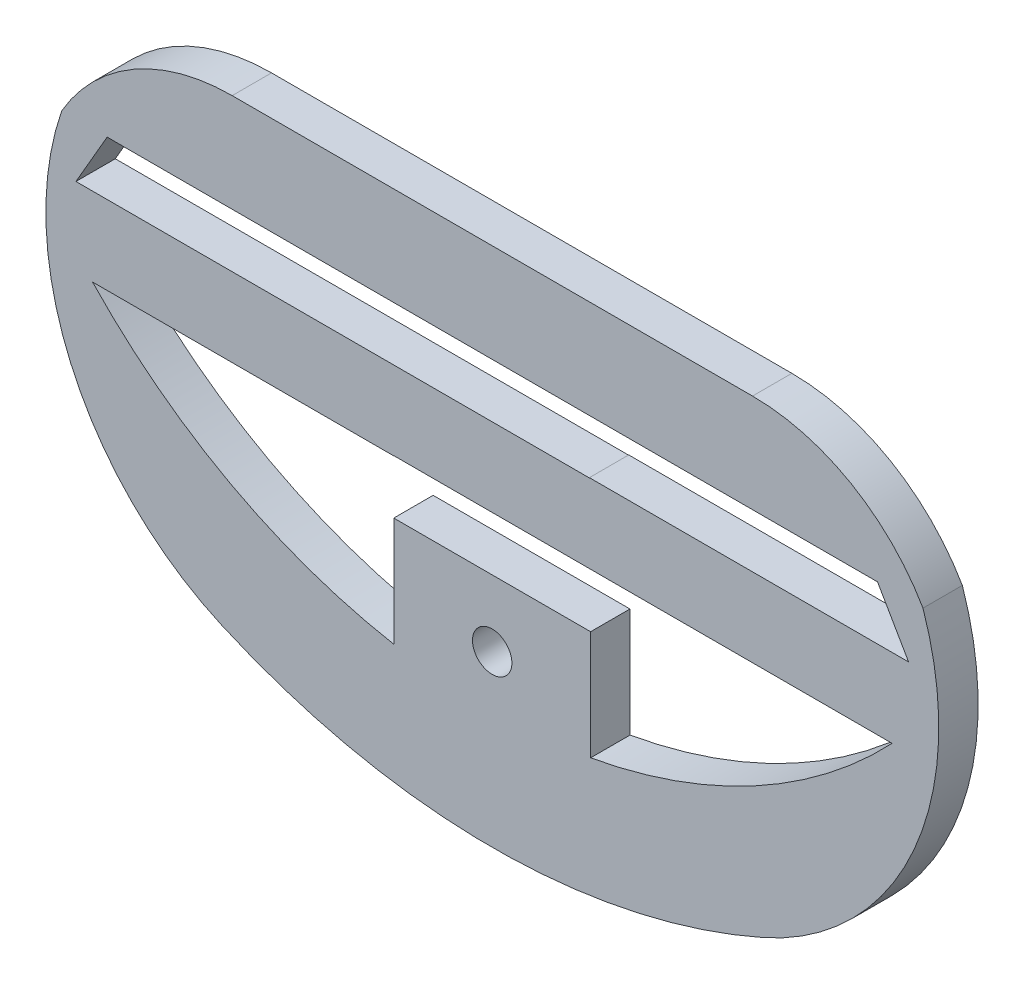
ISO-10303-21;
HEADER;
FILE_DESCRIPTION(('STEP AP214'),'2;1');
FILE_NAME('part.step','',(''),(''),'','','');
FILE_SCHEMA(('AUTOMOTIVE_DESIGN { 1 0 10303 214 1 1 1 1 }'));
ENDSEC;
DATA;
#1=APPLICATION_CONTEXT('core data for automotive mechanical design processes');
#2=APPLICATION_PROTOCOL_DEFINITION('international standard','automotive_design',2000,#1);
#3=PRODUCT_CONTEXT('',#1,'mechanical');
#4=PRODUCT('Part','Part','',(#3));
#5=PRODUCT_RELATED_PRODUCT_CATEGORY('part','',(#4));
#6=PRODUCT_DEFINITION_FORMATION('','',#4);
#7=PRODUCT_DEFINITION_CONTEXT('part definition',#1,'design');
#8=PRODUCT_DEFINITION('design','',#6,#7);
#9=PRODUCT_DEFINITION_SHAPE('','',#8);
#10=(LENGTH_UNIT() NAMED_UNIT(*) SI_UNIT(.MILLI.,.METRE.));
#11=(NAMED_UNIT(*) PLANE_ANGLE_UNIT() SI_UNIT($,.RADIAN.));
#12=(NAMED_UNIT(*) SI_UNIT($,.STERADIAN.) SOLID_ANGLE_UNIT());
#13=UNCERTAINTY_MEASURE_WITH_UNIT(LENGTH_MEASURE(1.E-05),#10,'distance_accuracy_value','');
#14=(GEOMETRIC_REPRESENTATION_CONTEXT(3) GLOBAL_UNCERTAINTY_ASSIGNED_CONTEXT((#13)) GLOBAL_UNIT_ASSIGNED_CONTEXT((#10,
#11,#12)) REPRESENTATION_CONTEXT('',''));
#15=CARTESIAN_POINT('',(0.,0.,0.));
#16=DIRECTION('',(0.,0.,1.));
#17=DIRECTION('',(1.,0.,0.));
#18=AXIS2_PLACEMENT_3D('',#15,#16,#17);
#19=CARTESIAN_POINT('',(0.,0.,2.));
#20=DIRECTION('',(0.,0.,-1.));
#21=DIRECTION('',(-1.,0.,0.));
#22=AXIS2_PLACEMENT_3D('',#19,#20,#21);
#23=CYLINDRICAL_SURFACE('',#22,33.96);
#24=CARTESIAN_POINT('',(0.,0.,0.));
#25=DIRECTION('',(0.,0.,1.));
#26=DIRECTION('',(1.,0.,0.));
#27=AXIS2_PLACEMENT_3D('',#24,#25,#26);
#28=CIRCLE('',#27,33.96);
#29=CARTESIAN_POINT('',(-13.7477446250861,-31.0528761586333,0.));
#30=VERTEX_POINT('',#29);
#31=CARTESIAN_POINT('',(13.7709780833439,-31.0425798320317,0.));
#32=VERTEX_POINT('',#31);
#33=EDGE_CURVE('E233',#30,#32,#28,.T.);
#34=ORIENTED_EDGE('',*,*,#33,.T.);
#35=DIRECTION('',(0.,0.,-1.));
#36=VECTOR('',#35,1.);
#37=CARTESIAN_POINT('',(13.7709780833439,-31.0425798320317,2.));
#38=LINE('',#37,#36);
#39=CARTESIAN_POINT('',(13.7709780833439,-31.0425798320317,2.));
#40=VERTEX_POINT('',#39);
#41=EDGE_CURVE('E50',#32,#40,#38,.F.);
#42=ORIENTED_EDGE('',*,*,#41,.T.);
#43=CARTESIAN_POINT('',(0.,0.,2.));
#44=DIRECTION('',(0.,0.,1.));
#45=DIRECTION('',(1.,0.,0.));
#46=AXIS2_PLACEMENT_3D('',#43,#44,#45);
#47=CIRCLE('',#46,33.96);
#48=CARTESIAN_POINT('',(-13.7477446250861,-31.0528761586333,2.));
#49=VERTEX_POINT('',#48);
#50=EDGE_CURVE('E214',#49,#40,#47,.T.);
#51=ORIENTED_EDGE('',*,*,#50,.F.);
#52=DIRECTION('',(0.,0.,-1.));
#53=VECTOR('',#52,1.);
#54=CARTESIAN_POINT('',(-13.7477446250861,-31.0528761586333,2.));
#55=LINE('',#54,#53);
#56=EDGE_CURVE('E283',#49,#30,#55,.T.);
#57=ORIENTED_EDGE('',*,*,#56,.T.);
#58=EDGE_LOOP('',(#34,#42,#51,#57));
#59=FACE_BOUND('',#58,.T.);
#60=ADVANCED_FACE('F35',(#59),#23,.T.);
#61=CARTESIAN_POINT('',(0.,0.,2.));
#62=DIRECTION('',(0.,0.,1.));
#63=DIRECTION('',(1.,0.,0.));
#64=AXIS2_PLACEMENT_3D('',#61,#62,#63);
#65=PLANE('',#64);
#66=DIRECTION('',(0.499999999999998,-0.86602540378444,0.));
#67=VECTOR('',#66,1.);
#68=CARTESIAN_POINT('',(9.27398162348433,5.3543357867783,2.));
#69=LINE('',#68,#67);
#70=CARTESIAN_POINT('',(19.5760693092514,-12.489403509,2.));
#71=VERTEX_POINT('',#70);
#72=CARTESIAN_POINT('',(21.1546665809614,-15.2236141882913,2.));
#73=VERTEX_POINT('',#72);
#74=EDGE_CURVE('E191',#71,#73,#69,.T.);
#75=ORIENTED_EDGE('',*,*,#74,.T.);
#76=DIRECTION('',(1.,0.,0.));
#77=VECTOR('',#76,1.);
#78=CARTESIAN_POINT('',(0.,-15.2236141882913,2.));
#79=LINE('',#78,#77);
#80=CARTESIAN_POINT('',(4.93751626275969,-15.2236141882913,2.));
#81=VERTEX_POINT('',#80);
#82=EDGE_CURVE('E570',#81,#73,#79,.T.);
#83=ORIENTED_EDGE('',*,*,#82,.F.);
#84=DIRECTION('',(0.,1.,0.));
#85=VECTOR('',#84,1.);
#86=CARTESIAN_POINT('',(4.93751626275969,0.,2.));
#87=LINE('',#86,#85);
#88=CARTESIAN_POINT('',(4.93751626275969,-15.2357893207087,2.));
#89=VERTEX_POINT('',#88);
#90=EDGE_CURVE('E573',#89,#81,#87,.T.);
#91=ORIENTED_EDGE('',*,*,#90,.F.);
#92=DIRECTION('',(-1.,0.,0.));
#93=VECTOR('',#92,1.);
#94=CARTESIAN_POINT('',(0.,-15.2357893207087,2.));
#95=LINE('',#94,#93);
#96=CARTESIAN_POINT('',(-21.1467627991821,-15.2357893207087,2.));
#97=VERTEX_POINT('',#96);
#98=EDGE_CURVE('E580',#89,#97,#95,.T.);
#99=ORIENTED_EDGE('',*,*,#98,.T.);
#100=DIRECTION('',(-0.499999999999998,-0.86602540378444,0.));
#101=VECTOR('',#100,1.);
#102=CARTESIAN_POINT('',(-9.26278180016591,5.34786956577053,2.));
#103=LINE('',#102,#101);
#104=CARTESIAN_POINT('',(-19.5611362114935,-12.489403509,2.));
#105=VERTEX_POINT('',#104);
#106=EDGE_CURVE('E182',#105,#97,#103,.T.);
#107=ORIENTED_EDGE('',*,*,#106,.F.);
#108=DIRECTION('',(-1.,0.,0.));
#109=VECTOR('',#108,1.);
#110=CARTESIAN_POINT('',(0.,-12.489403509,2.));
#111=LINE('',#110,#109);
#112=EDGE_CURVE('E190',#71,#105,#111,.T.);
#113=ORIENTED_EDGE('',*,*,#112,.F.);
#114=EDGE_LOOP('',(#75,#83,#91,#99,#107,#113));
#115=FACE_BOUND('',#114,.T.);
#116=CARTESIAN_POINT('',(0.,0.,2.));
#117=DIRECTION('',(0.,0.,1.));
#118=DIRECTION('',(1.,0.,0.));
#119=AXIS2_PLACEMENT_3D('',#116,#117,#118);
#120=CIRCLE('',#119,27.97);
#121=CARTESIAN_POINT('',(-20.3053024899731,-19.2357893207087,2.));
#122=VERTEX_POINT('',#121);
#123=CARTESIAN_POINT('',(-5.,-27.5194640209434,2.));
#124=VERTEX_POINT('',#123);
#125=EDGE_CURVE('E212',#122,#124,#120,.T.);
#126=ORIENTED_EDGE('',*,*,#125,.F.);
#127=DIRECTION('',(-1.,0.,0.));
#128=VECTOR('',#127,1.);
#129=CARTESIAN_POINT('',(0.,-19.2357893207087,2.));
#130=LINE('',#129,#128);
#131=CARTESIAN_POINT('',(-5.,-19.2357893207087,2.));
#132=VERTEX_POINT('',#131);
#133=EDGE_CURVE('E583',#132,#122,#130,.T.);
#134=ORIENTED_EDGE('',*,*,#133,.F.);
#135=DIRECTION('',(0.,1.,0.));
#136=VECTOR('',#135,1.);
#137=CARTESIAN_POINT('',(-5.,0.,2.));
#138=LINE('',#137,#136);
#139=CARTESIAN_POINT('',(-5.,-19.2236141882913,2.));
#140=VERTEX_POINT('',#139);
#141=EDGE_CURVE('E569',#132,#140,#138,.T.);
#142=ORIENTED_EDGE('',*,*,#141,.T.);
#143=DIRECTION('',(1.,0.,0.));
#144=VECTOR('',#143,1.);
#145=CARTESIAN_POINT('',(0.,-19.2236141882913,2.));
#146=LINE('',#145,#144);
#147=CARTESIAN_POINT('',(20.3168294165139,-19.2236141882913,2.));
#148=VERTEX_POINT('',#147);
#149=EDGE_CURVE('E566',#140,#148,#146,.T.);
#150=ORIENTED_EDGE('',*,*,#149,.T.);
#151=CARTESIAN_POINT('',(0.,0.,2.));
#152=DIRECTION('',(0.,0.,1.));
#153=DIRECTION('',(1.,0.,0.));
#154=AXIS2_PLACEMENT_3D('',#151,#152,#153);
#155=CIRCLE('',#154,27.97);
#156=CARTESIAN_POINT('',(5.,-27.5194640209434,2.));
#157=VERTEX_POINT('',#156);
#158=EDGE_CURVE('E217',#157,#148,#155,.T.);
#159=ORIENTED_EDGE('',*,*,#158,.F.);
#160=DIRECTION('',(0.,-1.,0.));
#161=VECTOR('',#160,1.);
#162=CARTESIAN_POINT('',(5.,0.,2.));
#163=LINE('',#162,#161);
#164=CARTESIAN_POINT('',(5.,-21.97,2.));
#165=VERTEX_POINT('',#164);
#166=EDGE_CURVE('E220',#165,#157,#163,.T.);
#167=ORIENTED_EDGE('',*,*,#166,.F.);
#168=DIRECTION('',(-1.,0.,0.));
#169=VECTOR('',#168,1.);
#170=CARTESIAN_POINT('',(0.,-21.97,2.));
#171=LINE('',#170,#169);
#172=CARTESIAN_POINT('',(-5.,-21.97,2.));
#173=VERTEX_POINT('',#172);
#174=EDGE_CURVE('E223',#165,#173,#171,.T.);
#175=ORIENTED_EDGE('',*,*,#174,.T.);
#176=DIRECTION('',(0.,-1.,0.));
#177=VECTOR('',#176,1.);
#178=CARTESIAN_POINT('',(-5.,0.,2.));
#179=LINE('',#178,#177);
#180=EDGE_CURVE('E225',#173,#124,#179,.T.);
#181=ORIENTED_EDGE('',*,*,#180,.T.);
#182=EDGE_LOOP('',(#126,#134,#142,#150,#159,#167,#175,#181));
#183=FACE_BOUND('',#182,.T.);
#184=CARTESIAN_POINT('',(0.,-25.35,2.));
#185=DIRECTION('',(0.,0.,1.));
#186=DIRECTION('',(1.,0.,0.));
#187=AXIS2_PLACEMENT_3D('',#184,#185,#186);
#188=CIRCLE('',#187,1.);
#189=CARTESIAN_POINT('',(1.,-25.35,2.));
#190=VERTEX_POINT('',#189);
#191=EDGE_CURVE('E228',#190,#190,#188,.T.);
#192=ORIENTED_EDGE('',*,*,#191,.F.);
#193=EDGE_LOOP('',(#192));
#194=FACE_BOUND('',#193,.T.);
#195=ORIENTED_EDGE('',*,*,#50,.T.);
#196=CARTESIAN_POINT('',(7.68839059070083,-17.3311929804276,2.));
#197=DIRECTION('',(0.,0.,1.));
#198=DIRECTION('',(1.,0.,0.));
#199=AXIS2_PLACEMENT_3D('',#196,#197,#198);
#200=CIRCLE('',#199,15.);
#201=CARTESIAN_POINT('',(21.8854703860099,-12.489403509,2.));
#202=VERTEX_POINT('',#201);
#203=EDGE_CURVE('E11',#40,#202,#200,.T.);
#204=ORIENTED_EDGE('',*,*,#203,.T.);
#205=CARTESIAN_POINT('',(13.2252163481655,-17.489403509,2.));
#206=DIRECTION('',(0.,0.,1.));
#207=DIRECTION('',(1.,0.,0.));
#208=AXIS2_PLACEMENT_3D('',#205,#206,#207);
#209=CIRCLE('',#208,10.);
#210=CARTESIAN_POINT('',(13.2252163481655,-7.489403509,2.));
#211=VERTEX_POINT('',#210);
#212=EDGE_CURVE('E272',#202,#211,#209,.T.);
#213=ORIENTED_EDGE('',*,*,#212,.T.);
#214=DIRECTION('',(1.,0.,0.));
#215=VECTOR('',#214,1.);
#216=CARTESIAN_POINT('',(0.,-7.489403509,2.));
#217=LINE('',#216,#215);
#218=CARTESIAN_POINT('',(-13.2102832504076,-7.489403509,2.));
#219=VERTEX_POINT('',#218);
#220=EDGE_CURVE('E199',#219,#211,#217,.T.);
#221=ORIENTED_EDGE('',*,*,#220,.F.);
#222=CARTESIAN_POINT('',(-13.2102832504076,-17.489403509,2.));
#223=DIRECTION('',(0.,0.,1.));
#224=DIRECTION('',(1.,0.,0.));
#225=AXIS2_PLACEMENT_3D('',#222,#223,#224);
#226=CIRCLE('',#225,10.);
#227=CARTESIAN_POINT('',(-21.870537288252,-12.489403509,2.));
#228=VERTEX_POINT('',#227);
#229=EDGE_CURVE('E274',#219,#228,#226,.T.);
#230=ORIENTED_EDGE('',*,*,#229,.T.);
#231=CARTESIAN_POINT('',(-7.67541926064876,-17.3369414595903,2.));
#232=DIRECTION('',(0.,0.,1.));
#233=DIRECTION('',(1.,0.,0.));
#234=AXIS2_PLACEMENT_3D('',#231,#232,#233);
#235=CIRCLE('',#234,15.);
#236=EDGE_CURVE('E43',#228,#49,#235,.T.);
#237=ORIENTED_EDGE('',*,*,#236,.T.);
#238=EDGE_LOOP('',(#195,#204,#213,#221,#230,#237));
#239=FACE_BOUND('',#238,.T.);
#240=ADVANCED_FACE('F296',(#115,#183,#194,#239),#65,.T.);
#241=CARTESIAN_POINT('',(0.,0.,0.));
#242=DIRECTION('',(0.,0.,1.));
#243=DIRECTION('',(1.,0.,0.));
#244=AXIS2_PLACEMENT_3D('',#241,#242,#243);
#245=PLANE('',#244);
#246=DIRECTION('',(1.,0.,0.));
#247=VECTOR('',#246,1.);
#248=CARTESIAN_POINT('',(0.,-15.2236141882913,0.));
#249=LINE('',#248,#247);
#250=CARTESIAN_POINT('',(4.93751626275969,-15.2236141882913,0.));
#251=VERTEX_POINT('',#250);
#252=CARTESIAN_POINT('',(21.1546665809614,-15.2236141882913,0.));
#253=VERTEX_POINT('',#252);
#254=EDGE_CURVE('E597',#251,#253,#249,.T.);
#255=ORIENTED_EDGE('',*,*,#254,.T.);
#256=DIRECTION('',(0.499999999999998,-0.86602540378444,0.));
#257=VECTOR('',#256,1.);
#258=CARTESIAN_POINT('',(9.27398162348433,5.3543357867783,0.));
#259=LINE('',#258,#257);
#260=CARTESIAN_POINT('',(19.5760693092514,-12.489403509,0.));
#261=VERTEX_POINT('',#260);
#262=EDGE_CURVE('E197',#261,#253,#259,.T.);
#263=ORIENTED_EDGE('',*,*,#262,.F.);
#264=DIRECTION('',(-1.,0.,0.));
#265=VECTOR('',#264,1.);
#266=CARTESIAN_POINT('',(0.,-12.489403509,0.));
#267=LINE('',#266,#265);
#268=CARTESIAN_POINT('',(-19.5611362114935,-12.489403509,0.));
#269=VERTEX_POINT('',#268);
#270=EDGE_CURVE('E188',#261,#269,#267,.T.);
#271=ORIENTED_EDGE('',*,*,#270,.T.);
#272=DIRECTION('',(-0.499999999999998,-0.86602540378444,0.));
#273=VECTOR('',#272,1.);
#274=CARTESIAN_POINT('',(-9.26278180016591,5.34786956577053,0.));
#275=LINE('',#274,#273);
#276=CARTESIAN_POINT('',(-21.1467627991821,-15.2357893207087,0.));
#277=VERTEX_POINT('',#276);
#278=EDGE_CURVE('E172',#269,#277,#275,.T.);
#279=ORIENTED_EDGE('',*,*,#278,.T.);
#280=DIRECTION('',(-1.,0.,0.));
#281=VECTOR('',#280,1.);
#282=CARTESIAN_POINT('',(0.,-15.2357893207087,0.));
#283=LINE('',#282,#281);
#284=CARTESIAN_POINT('',(4.93751626275969,-15.2357893207087,0.));
#285=VERTEX_POINT('',#284);
#286=EDGE_CURVE('E611',#285,#277,#283,.T.);
#287=ORIENTED_EDGE('',*,*,#286,.F.);
#288=DIRECTION('',(0.,1.,0.));
#289=VECTOR('',#288,1.);
#290=CARTESIAN_POINT('',(4.93751626275969,0.,0.));
#291=LINE('',#290,#289);
#292=EDGE_CURVE('E609',#285,#251,#291,.T.);
#293=ORIENTED_EDGE('',*,*,#292,.T.);
#294=EDGE_LOOP('',(#255,#263,#271,#279,#287,#293));
#295=FACE_BOUND('',#294,.T.);
#296=CARTESIAN_POINT('',(0.,-25.35,0.));
#297=DIRECTION('',(0.,0.,1.));
#298=DIRECTION('',(1.,0.,0.));
#299=AXIS2_PLACEMENT_3D('',#296,#297,#298);
#300=CIRCLE('',#299,1.);
#301=CARTESIAN_POINT('',(1.,-25.35,0.));
#302=VERTEX_POINT('',#301);
#303=EDGE_CURVE('E215',#302,#302,#300,.T.);
#304=ORIENTED_EDGE('',*,*,#303,.T.);
#305=EDGE_LOOP('',(#304));
#306=FACE_BOUND('',#305,.T.);
#307=DIRECTION('',(-1.,0.,0.));
#308=VECTOR('',#307,1.);
#309=CARTESIAN_POINT('',(0.,-19.2357893207087,0.));
#310=LINE('',#309,#308);
#311=CARTESIAN_POINT('',(-5.,-19.2357893207087,0.));
#312=VERTEX_POINT('',#311);
#313=CARTESIAN_POINT('',(-20.3053024899731,-19.2357893207087,0.));
#314=VERTEX_POINT('',#313);
#315=EDGE_CURVE('E612',#312,#314,#310,.T.);
#316=ORIENTED_EDGE('',*,*,#315,.T.);
#317=CARTESIAN_POINT('',(0.,0.,0.));
#318=DIRECTION('',(0.,0.,1.));
#319=DIRECTION('',(1.,0.,0.));
#320=AXIS2_PLACEMENT_3D('',#317,#318,#319);
#321=CIRCLE('',#320,27.97);
#322=CARTESIAN_POINT('',(-5.,-27.5194640209434,0.));
#323=VERTEX_POINT('',#322);
#324=EDGE_CURVE('E202',#314,#323,#321,.T.);
#325=ORIENTED_EDGE('',*,*,#324,.T.);
#326=DIRECTION('',(0.,-1.,0.));
#327=VECTOR('',#326,1.);
#328=CARTESIAN_POINT('',(-5.,0.,0.));
#329=LINE('',#328,#327);
#330=CARTESIAN_POINT('',(-5.,-21.97,0.));
#331=VERTEX_POINT('',#330);
#332=EDGE_CURVE('E243',#331,#323,#329,.T.);
#333=ORIENTED_EDGE('',*,*,#332,.F.);
#334=DIRECTION('',(-1.,0.,0.));
#335=VECTOR('',#334,1.);
#336=CARTESIAN_POINT('',(0.,-21.97,0.));
#337=LINE('',#336,#335);
#338=CARTESIAN_POINT('',(5.,-21.97,0.));
#339=VERTEX_POINT('',#338);
#340=EDGE_CURVE('E241',#339,#331,#337,.T.);
#341=ORIENTED_EDGE('',*,*,#340,.F.);
#342=DIRECTION('',(0.,-1.,0.));
#343=VECTOR('',#342,1.);
#344=CARTESIAN_POINT('',(5.,0.,0.));
#345=LINE('',#344,#343);
#346=CARTESIAN_POINT('',(5.,-27.5194640209434,0.));
#347=VERTEX_POINT('',#346);
#348=EDGE_CURVE('E238',#339,#347,#345,.T.);
#349=ORIENTED_EDGE('',*,*,#348,.T.);
#350=CARTESIAN_POINT('',(0.,0.,0.));
#351=DIRECTION('',(0.,0.,1.));
#352=DIRECTION('',(1.,0.,0.));
#353=AXIS2_PLACEMENT_3D('',#350,#351,#352);
#354=CIRCLE('',#353,27.97);
#355=CARTESIAN_POINT('',(20.3168294165139,-19.2236141882913,0.));
#356=VERTEX_POINT('',#355);
#357=EDGE_CURVE('E235',#347,#356,#354,.T.);
#358=ORIENTED_EDGE('',*,*,#357,.T.);
#359=DIRECTION('',(1.,0.,0.));
#360=VECTOR('',#359,1.);
#361=CARTESIAN_POINT('',(0.,-19.2236141882913,0.));
#362=LINE('',#361,#360);
#363=CARTESIAN_POINT('',(-5.,-19.2236141882913,0.));
#364=VERTEX_POINT('',#363);
#365=EDGE_CURVE('E555',#364,#356,#362,.T.);
#366=ORIENTED_EDGE('',*,*,#365,.F.);
#367=DIRECTION('',(0.,1.,0.));
#368=VECTOR('',#367,1.);
#369=CARTESIAN_POINT('',(-5.,0.,0.));
#370=LINE('',#369,#368);
#371=EDGE_CURVE('E585',#312,#364,#370,.T.);
#372=ORIENTED_EDGE('',*,*,#371,.F.);
#373=EDGE_LOOP('',(#316,#325,#333,#341,#349,#358,#366,#372));
#374=FACE_BOUND('',#373,.T.);
#375=CARTESIAN_POINT('',(13.2252163481655,-17.489403509,0.));
#376=DIRECTION('',(0.,0.,1.));
#377=DIRECTION('',(1.,0.,0.));
#378=AXIS2_PLACEMENT_3D('',#375,#376,#377);
#379=CIRCLE('',#378,10.);
#380=CARTESIAN_POINT('',(13.2252163481655,-7.489403509,0.));
#381=VERTEX_POINT('',#380);
#382=CARTESIAN_POINT('',(21.8854703860099,-12.489403509,0.));
#383=VERTEX_POINT('',#382);
#384=EDGE_CURVE('E262',#381,#383,#379,.F.);
#385=ORIENTED_EDGE('',*,*,#384,.T.);
#386=CARTESIAN_POINT('',(7.68839059070083,-17.3311929804276,0.));
#387=DIRECTION('',(0.,0.,1.));
#388=DIRECTION('',(1.,0.,0.));
#389=AXIS2_PLACEMENT_3D('',#386,#387,#388);
#390=CIRCLE('',#389,15.);
#391=EDGE_CURVE('E281',#383,#32,#390,.F.);
#392=ORIENTED_EDGE('',*,*,#391,.T.);
#393=ORIENTED_EDGE('',*,*,#33,.F.);
#394=CARTESIAN_POINT('',(-7.67541926064876,-17.3369414595903,0.));
#395=DIRECTION('',(0.,0.,1.));
#396=DIRECTION('',(1.,0.,0.));
#397=AXIS2_PLACEMENT_3D('',#394,#395,#396);
#398=CIRCLE('',#397,15.);
#399=CARTESIAN_POINT('',(-21.870537288252,-12.489403509,0.));
#400=VERTEX_POINT('',#399);
#401=EDGE_CURVE('E279',#30,#400,#398,.F.);
#402=ORIENTED_EDGE('',*,*,#401,.T.);
#403=CARTESIAN_POINT('',(-13.2102832504076,-17.489403509,0.));
#404=DIRECTION('',(0.,0.,1.));
#405=DIRECTION('',(1.,0.,0.));
#406=AXIS2_PLACEMENT_3D('',#403,#404,#405);
#407=CIRCLE('',#406,10.);
#408=CARTESIAN_POINT('',(-13.2102832504076,-7.489403509,0.));
#409=VERTEX_POINT('',#408);
#410=EDGE_CURVE('E265',#400,#409,#407,.F.);
#411=ORIENTED_EDGE('',*,*,#410,.T.);
#412=DIRECTION('',(1.,0.,0.));
#413=VECTOR('',#412,1.);
#414=CARTESIAN_POINT('',(0.,-7.489403509,0.));
#415=LINE('',#414,#413);
#416=EDGE_CURVE('E198',#409,#381,#415,.T.);
#417=ORIENTED_EDGE('',*,*,#416,.T.);
#418=EDGE_LOOP('',(#385,#392,#393,#402,#411,#417));
#419=FACE_BOUND('',#418,.T.);
#420=ADVANCED_FACE('F195',(#295,#306,#374,#419),#245,.F.);
#421=CARTESIAN_POINT('',(0.,-7.489403509,0.));
#422=DIRECTION('',(0.,-1.,0.));
#423=DIRECTION('',(0.,0.,-1.));
#424=AXIS2_PLACEMENT_3D('',#421,#422,#423);
#425=PLANE('',#424);
#426=ORIENTED_EDGE('',*,*,#416,.F.);
#427=DIRECTION('',(0.,0.,-1.));
#428=VECTOR('',#427,1.);
#429=CARTESIAN_POINT('',(-13.2102832504076,-7.489403509,2.));
#430=LINE('',#429,#428);
#431=EDGE_CURVE('E270',#409,#219,#430,.F.);
#432=ORIENTED_EDGE('',*,*,#431,.T.);
#433=ORIENTED_EDGE('',*,*,#220,.T.);
#434=DIRECTION('',(0.,0.,-1.));
#435=VECTOR('',#434,1.);
#436=CARTESIAN_POINT('',(13.2252163481655,-7.489403509,0.));
#437=LINE('',#436,#435);
#438=EDGE_CURVE('E267',#211,#381,#437,.T.);
#439=ORIENTED_EDGE('',*,*,#438,.T.);
#440=EDGE_LOOP('',(#426,#432,#433,#439));
#441=FACE_BOUND('',#440,.T.);
#442=ADVANCED_FACE('F303',(#441),#425,.F.);
#443=CARTESIAN_POINT('',(0.,-12.489403509,0.));
#444=DIRECTION('',(0.,1.,0.));
#445=DIRECTION('',(0.,0.,1.));
#446=AXIS2_PLACEMENT_3D('',#443,#444,#445);
#447=PLANE('',#446);
#448=ORIENTED_EDGE('',*,*,#112,.T.);
#449=DIRECTION('',(0.,0.,-1.));
#450=VECTOR('',#449,1.);
#451=CARTESIAN_POINT('',(-19.5611362114935,-12.489403509,6.76590762956678));
#452=LINE('',#451,#450);
#453=EDGE_CURVE('E176',#105,#269,#452,.T.);
#454=ORIENTED_EDGE('',*,*,#453,.T.);
#455=ORIENTED_EDGE('',*,*,#270,.F.);
#456=DIRECTION('',(0.,0.,-1.));
#457=VECTOR('',#456,1.);
#458=CARTESIAN_POINT('',(19.5760693092514,-12.489403509,0.));
#459=LINE('',#458,#457);
#460=EDGE_CURVE('E575',#71,#261,#459,.T.);
#461=ORIENTED_EDGE('',*,*,#460,.F.);
#462=EDGE_LOOP('',(#448,#454,#455,#461));
#463=FACE_BOUND('',#462,.T.);
#464=ADVANCED_FACE('F186',(#463),#447,.F.);
#465=CARTESIAN_POINT('',(0.,-15.2236141882913,0.));
#466=DIRECTION('',(0.,-1.,0.));
#467=DIRECTION('',(0.,0.,-1.));
#468=AXIS2_PLACEMENT_3D('',#465,#466,#467);
#469=PLANE('',#468);
#470=DIRECTION('',(0.,0.,1.));
#471=VECTOR('',#470,1.);
#472=CARTESIAN_POINT('',(21.1546665809614,-15.2236141882913,0.));
#473=LINE('',#472,#471);
#474=EDGE_CURVE('E257',#253,#73,#473,.T.);
#475=ORIENTED_EDGE('',*,*,#474,.F.);
#476=ORIENTED_EDGE('',*,*,#254,.F.);
#477=DIRECTION('',(0.,0.,1.));
#478=VECTOR('',#477,1.);
#479=CARTESIAN_POINT('',(4.93751626275969,-15.2236141882913,0.));
#480=LINE('',#479,#478);
#481=EDGE_CURVE('E550',#251,#81,#480,.T.);
#482=ORIENTED_EDGE('',*,*,#481,.T.);
#483=ORIENTED_EDGE('',*,*,#82,.T.);
#484=EDGE_LOOP('',(#475,#476,#482,#483));
#485=FACE_BOUND('',#484,.T.);
#486=ADVANCED_FACE('F329',(#485),#469,.F.);
#487=CARTESIAN_POINT('',(0.,0.,2.));
#488=DIRECTION('',(0.,0.,-1.));
#489=DIRECTION('',(-1.,0.,0.));
#490=AXIS2_PLACEMENT_3D('',#487,#488,#489);
#491=CYLINDRICAL_SURFACE('',#490,27.97);
#492=ORIENTED_EDGE('',*,*,#324,.F.);
#493=DIRECTION('',(0.,0.,1.));
#494=VECTOR('',#493,1.);
#495=CARTESIAN_POINT('',(-20.3053024899731,-19.2357893207087,0.));
#496=LINE('',#495,#494);
#497=EDGE_CURVE('E587',#314,#122,#496,.T.);
#498=ORIENTED_EDGE('',*,*,#497,.T.);
#499=ORIENTED_EDGE('',*,*,#125,.T.);
#500=DIRECTION('',(0.,0.,-1.));
#501=VECTOR('',#500,1.);
#502=CARTESIAN_POINT('',(-5.,-27.5194640209434,2.));
#503=LINE('',#502,#501);
#504=EDGE_CURVE('E231',#124,#323,#503,.T.);
#505=ORIENTED_EDGE('',*,*,#504,.T.);
#506=EDGE_LOOP('',(#492,#498,#499,#505));
#507=FACE_BOUND('',#506,.T.);
#508=ADVANCED_FACE('F326',(#507),#491,.F.);
#509=CARTESIAN_POINT('',(0.,0.,2.));
#510=DIRECTION('',(0.,0.,-1.));
#511=DIRECTION('',(-1.,0.,0.));
#512=AXIS2_PLACEMENT_3D('',#509,#510,#511);
#513=CYLINDRICAL_SURFACE('',#512,27.97);
#514=DIRECTION('',(0.,0.,1.));
#515=VECTOR('',#514,1.);
#516=CARTESIAN_POINT('',(20.3168294165139,-19.2236141882913,0.));
#517=LINE('',#516,#515);
#518=EDGE_CURVE('E546',#356,#148,#517,.T.);
#519=ORIENTED_EDGE('',*,*,#518,.F.);
#520=ORIENTED_EDGE('',*,*,#357,.F.);
#521=DIRECTION('',(0.,0.,-1.));
#522=VECTOR('',#521,1.);
#523=CARTESIAN_POINT('',(5.,-27.5194640209434,2.));
#524=LINE('',#523,#522);
#525=EDGE_CURVE('E255',#157,#347,#524,.T.);
#526=ORIENTED_EDGE('',*,*,#525,.F.);
#527=ORIENTED_EDGE('',*,*,#158,.T.);
#528=EDGE_LOOP('',(#519,#520,#526,#527));
#529=FACE_BOUND('',#528,.T.);
#530=ADVANCED_FACE('F324',(#529),#513,.F.);
#531=CARTESIAN_POINT('',(5.,0.,2.));
#532=DIRECTION('',(1.,0.,0.));
#533=DIRECTION('',(0.,0.,-1.));
#534=AXIS2_PLACEMENT_3D('',#531,#532,#533);
#535=PLANE('',#534);
#536=ORIENTED_EDGE('',*,*,#348,.F.);
#537=DIRECTION('',(0.,0.,-1.));
#538=VECTOR('',#537,1.);
#539=CARTESIAN_POINT('',(5.,-21.97,2.));
#540=LINE('',#539,#538);
#541=EDGE_CURVE('E253',#165,#339,#540,.T.);
#542=ORIENTED_EDGE('',*,*,#541,.F.);
#543=ORIENTED_EDGE('',*,*,#166,.T.);
#544=ORIENTED_EDGE('',*,*,#525,.T.);
#545=EDGE_LOOP('',(#536,#542,#543,#544));
#546=FACE_BOUND('',#545,.T.);
#547=ADVANCED_FACE('F510',(#546),#535,.T.);
#548=CARTESIAN_POINT('',(0.,-21.97,2.));
#549=DIRECTION('',(0.,-1.,0.));
#550=DIRECTION('',(1.,0.,0.));
#551=AXIS2_PLACEMENT_3D('',#548,#549,#550);
#552=PLANE('',#551);
#553=ORIENTED_EDGE('',*,*,#340,.T.);
#554=DIRECTION('',(0.,0.,-1.));
#555=VECTOR('',#554,1.);
#556=CARTESIAN_POINT('',(-5.,-21.97,2.));
#557=LINE('',#556,#555);
#558=EDGE_CURVE('E250',#173,#331,#557,.T.);
#559=ORIENTED_EDGE('',*,*,#558,.F.);
#560=ORIENTED_EDGE('',*,*,#174,.F.);
#561=ORIENTED_EDGE('',*,*,#541,.T.);
#562=EDGE_LOOP('',(#553,#559,#560,#561));
#563=FACE_BOUND('',#562,.T.);
#564=ADVANCED_FACE('F502',(#563),#552,.F.);
#565=CARTESIAN_POINT('',(-5.,0.,2.));
#566=DIRECTION('',(1.,0.,0.));
#567=DIRECTION('',(0.,0.,-1.));
#568=AXIS2_PLACEMENT_3D('',#565,#566,#567);
#569=PLANE('',#568);
#570=ORIENTED_EDGE('',*,*,#332,.T.);
#571=ORIENTED_EDGE('',*,*,#504,.F.);
#572=ORIENTED_EDGE('',*,*,#180,.F.);
#573=ORIENTED_EDGE('',*,*,#558,.T.);
#574=EDGE_LOOP('',(#570,#571,#572,#573));
#575=FACE_BOUND('',#574,.T.);
#576=ADVANCED_FACE('F493',(#575),#569,.F.);
#577=CARTESIAN_POINT('',(0.,-25.35,2.));
#578=DIRECTION('',(0.,0.,-1.));
#579=DIRECTION('',(-1.,0.,0.));
#580=AXIS2_PLACEMENT_3D('',#577,#578,#579);
#581=CYLINDRICAL_SURFACE('',#580,1.);
#582=ORIENTED_EDGE('',*,*,#191,.T.);
#583=EDGE_LOOP('',(#582));
#584=FACE_BOUND('',#583,.T.);
#585=ORIENTED_EDGE('',*,*,#303,.F.);
#586=EDGE_LOOP('',(#585));
#587=FACE_BOUND('',#586,.T.);
#588=ADVANCED_FACE('F484',(#584,#587),#581,.F.);
#589=CARTESIAN_POINT('',(-5.,0.,0.));
#590=DIRECTION('',(1.,0.,0.));
#591=DIRECTION('',(0.,0.,-1.));
#592=AXIS2_PLACEMENT_3D('',#589,#590,#591);
#593=PLANE('',#592);
#594=ORIENTED_EDGE('',*,*,#141,.F.);
#595=DIRECTION('',(0.,0.,1.));
#596=VECTOR('',#595,1.);
#597=CARTESIAN_POINT('',(-5.,-19.2357893207087,0.));
#598=LINE('',#597,#596);
#599=EDGE_CURVE('E210',#312,#132,#598,.T.);
#600=ORIENTED_EDGE('',*,*,#599,.F.);
#601=ORIENTED_EDGE('',*,*,#371,.T.);
#602=DIRECTION('',(0.,0.,1.));
#603=VECTOR('',#602,1.);
#604=CARTESIAN_POINT('',(-5.,-19.2236141882913,0.));
#605=LINE('',#604,#603);
#606=EDGE_CURVE('E207',#364,#140,#605,.T.);
#607=ORIENTED_EDGE('',*,*,#606,.T.);
#608=EDGE_LOOP('',(#594,#600,#601,#607));
#609=FACE_BOUND('',#608,.T.);
#610=ADVANCED_FACE('F477',(#609),#593,.T.);
#611=CARTESIAN_POINT('',(0.,-19.2357893207087,0.));
#612=DIRECTION('',(0.,1.,0.));
#613=DIRECTION('',(-1.,0.,0.));
#614=AXIS2_PLACEMENT_3D('',#611,#612,#613);
#615=PLANE('',#614);
#616=ORIENTED_EDGE('',*,*,#133,.T.);
#617=ORIENTED_EDGE('',*,*,#497,.F.);
#618=ORIENTED_EDGE('',*,*,#315,.F.);
#619=ORIENTED_EDGE('',*,*,#599,.T.);
#620=EDGE_LOOP('',(#616,#617,#618,#619));
#621=FACE_BOUND('',#620,.T.);
#622=ADVANCED_FACE('F469',(#621),#615,.F.);
#623=CARTESIAN_POINT('',(0.,-15.2357893207087,0.));
#624=DIRECTION('',(0.,1.,0.));
#625=DIRECTION('',(-1.,0.,0.));
#626=AXIS2_PLACEMENT_3D('',#623,#624,#625);
#627=PLANE('',#626);
#628=DIRECTION('',(0.,0.,-1.));
#629=VECTOR('',#628,1.);
#630=CARTESIAN_POINT('',(-21.1467627991821,-15.2357893207087,6.76590762956678));
#631=LINE('',#630,#629);
#632=EDGE_CURVE('E178',#97,#277,#631,.T.);
#633=ORIENTED_EDGE('',*,*,#632,.F.);
#634=ORIENTED_EDGE('',*,*,#98,.F.);
#635=DIRECTION('',(0.,0.,1.));
#636=VECTOR('',#635,1.);
#637=CARTESIAN_POINT('',(4.93751626275969,-15.2357893207087,0.));
#638=LINE('',#637,#636);
#639=EDGE_CURVE('E590',#285,#89,#638,.T.);
#640=ORIENTED_EDGE('',*,*,#639,.F.);
#641=ORIENTED_EDGE('',*,*,#286,.T.);
#642=EDGE_LOOP('',(#633,#634,#640,#641));
#643=FACE_BOUND('',#642,.T.);
#644=ADVANCED_FACE('F402',(#643),#627,.T.);
#645=CARTESIAN_POINT('',(4.93751626275969,0.,0.));
#646=DIRECTION('',(1.,0.,0.));
#647=DIRECTION('',(0.,1.,0.));
#648=AXIS2_PLACEMENT_3D('',#645,#646,#647);
#649=PLANE('',#648);
#650=ORIENTED_EDGE('',*,*,#90,.T.);
#651=ORIENTED_EDGE('',*,*,#481,.F.);
#652=ORIENTED_EDGE('',*,*,#292,.F.);
#653=ORIENTED_EDGE('',*,*,#639,.T.);
#654=EDGE_LOOP('',(#650,#651,#652,#653));
#655=FACE_BOUND('',#654,.T.);
#656=ADVANCED_FACE('F455',(#655),#649,.F.);
#657=CARTESIAN_POINT('',(0.,-19.2236141882913,0.));
#658=DIRECTION('',(0.,-1.,0.));
#659=DIRECTION('',(0.,0.,-1.));
#660=AXIS2_PLACEMENT_3D('',#657,#658,#659);
#661=PLANE('',#660);
#662=ORIENTED_EDGE('',*,*,#149,.F.);
#663=ORIENTED_EDGE('',*,*,#606,.F.);
#664=ORIENTED_EDGE('',*,*,#365,.T.);
#665=ORIENTED_EDGE('',*,*,#518,.T.);
#666=EDGE_LOOP('',(#662,#663,#664,#665));
#667=FACE_BOUND('',#666,.T.);
#668=ADVANCED_FACE('F385',(#667),#661,.T.);
#669=CARTESIAN_POINT('',(9.27398162348433,5.3543357867783,19.2680572476043));
#670=DIRECTION('',(0.866025403784439,0.499999999999998,0.));
#671=DIRECTION('',(-0.499999999999998,0.86602540378444,0.));
#672=AXIS2_PLACEMENT_3D('',#669,#670,#671);
#673=PLANE('',#672);
#674=ORIENTED_EDGE('',*,*,#74,.F.);
#675=ORIENTED_EDGE('',*,*,#460,.T.);
#676=ORIENTED_EDGE('',*,*,#262,.T.);
#677=ORIENTED_EDGE('',*,*,#474,.T.);
#678=EDGE_LOOP('',(#674,#675,#676,#677));
#679=FACE_BOUND('',#678,.T.);
#680=ADVANCED_FACE('F382',(#679),#673,.F.);
#681=CARTESIAN_POINT('',(-9.26278180016591,5.34786956577053,6.76590762956678));
#682=DIRECTION('',(0.86602540378444,-0.499999999999998,0.));
#683=DIRECTION('',(0.499999999999998,0.86602540378444,0.));
#684=AXIS2_PLACEMENT_3D('',#681,#682,#683);
#685=PLANE('',#684);
#686=ORIENTED_EDGE('',*,*,#453,.F.);
#687=ORIENTED_EDGE('',*,*,#106,.T.);
#688=ORIENTED_EDGE('',*,*,#632,.T.);
#689=ORIENTED_EDGE('',*,*,#278,.F.);
#690=EDGE_LOOP('',(#686,#687,#688,#689));
#691=FACE_BOUND('',#690,.T.);
#692=ADVANCED_FACE('F174',(#691),#685,.T.);
#693=CARTESIAN_POINT('',(-13.2102832504076,-17.489403509,6.76590762956678));
#694=DIRECTION('',(0.,0.,1.));
#695=DIRECTION('',(1.,0.,0.));
#696=AXIS2_PLACEMENT_3D('',#693,#694,#695);
#697=CYLINDRICAL_SURFACE('',#696,10.);
#698=ORIENTED_EDGE('',*,*,#229,.F.);
#699=ORIENTED_EDGE('',*,*,#431,.F.);
#700=ORIENTED_EDGE('',*,*,#410,.F.);
#701=DIRECTION('',(0.,0.,-1.));
#702=VECTOR('',#701,1.);
#703=CARTESIAN_POINT('',(-21.870537288252,-12.489403509,0.));
#704=LINE('',#703,#702);
#705=EDGE_CURVE('E259',#228,#400,#704,.T.);
#706=ORIENTED_EDGE('',*,*,#705,.F.);
#707=EDGE_LOOP('',(#698,#699,#700,#706));
#708=FACE_BOUND('',#707,.T.);
#709=ADVANCED_FACE('F308',(#708),#697,.T.);
#710=CARTESIAN_POINT('',(13.2252163481655,-17.489403509,0.));
#711=DIRECTION('',(0.,0.,1.));
#712=DIRECTION('',(1.,0.,0.));
#713=AXIS2_PLACEMENT_3D('',#710,#711,#712);
#714=CYLINDRICAL_SURFACE('',#713,10.);
#715=ORIENTED_EDGE('',*,*,#212,.F.);
#716=DIRECTION('',(0.,0.,-1.));
#717=VECTOR('',#716,1.);
#718=CARTESIAN_POINT('',(21.8854703860099,-12.489403509,2.));
#719=LINE('',#718,#717);
#720=EDGE_CURVE('E276',#383,#202,#719,.F.);
#721=ORIENTED_EDGE('',*,*,#720,.F.);
#722=ORIENTED_EDGE('',*,*,#384,.F.);
#723=ORIENTED_EDGE('',*,*,#438,.F.);
#724=EDGE_LOOP('',(#715,#721,#722,#723));
#725=FACE_BOUND('',#724,.T.);
#726=ADVANCED_FACE('F300',(#725),#714,.T.);
#727=CARTESIAN_POINT('',(7.68839059070083,-17.3311929804276,2.));
#728=DIRECTION('',(0.,0.,1.));
#729=DIRECTION('',(1.,0.,0.));
#730=AXIS2_PLACEMENT_3D('',#727,#728,#729);
#731=CYLINDRICAL_SURFACE('',#730,15.);
#732=ORIENTED_EDGE('',*,*,#203,.F.);
#733=ORIENTED_EDGE('',*,*,#41,.F.);
#734=ORIENTED_EDGE('',*,*,#391,.F.);
#735=ORIENTED_EDGE('',*,*,#720,.T.);
#736=EDGE_LOOP('',(#732,#733,#734,#735));
#737=FACE_BOUND('',#736,.T.);
#738=ADVANCED_FACE('F294',(#737),#731,.T.);
#739=CARTESIAN_POINT('',(-7.67541926064876,-17.3369414595903,6.76590762956678));
#740=DIRECTION('',(0.,0.,1.));
#741=DIRECTION('',(1.,0.,0.));
#742=AXIS2_PLACEMENT_3D('',#739,#740,#741);
#743=CYLINDRICAL_SURFACE('',#742,15.);
#744=ORIENTED_EDGE('',*,*,#236,.F.);
#745=ORIENTED_EDGE('',*,*,#705,.T.);
#746=ORIENTED_EDGE('',*,*,#401,.F.);
#747=ORIENTED_EDGE('',*,*,#56,.F.);
#748=EDGE_LOOP('',(#744,#745,#746,#747));
#749=FACE_BOUND('',#748,.T.);
#750=ADVANCED_FACE('F37',(#749),#743,.T.);
#751=CLOSED_SHELL('',(#60,#240,#420,#442,#464,#486,#508,#530,#547,#564,#576,#588,#610,#622,#644,
#656,#668,#680,#692,#709,#726,#738,#750));
#752=MANIFOLD_SOLID_BREP('B2',#751);
#753=ADVANCED_BREP_SHAPE_REPRESENTATION('',(#18,#752),#14);
#754=SHAPE_DEFINITION_REPRESENTATION(#9,#753);
ENDSEC;
END-ISO-10303-21;
